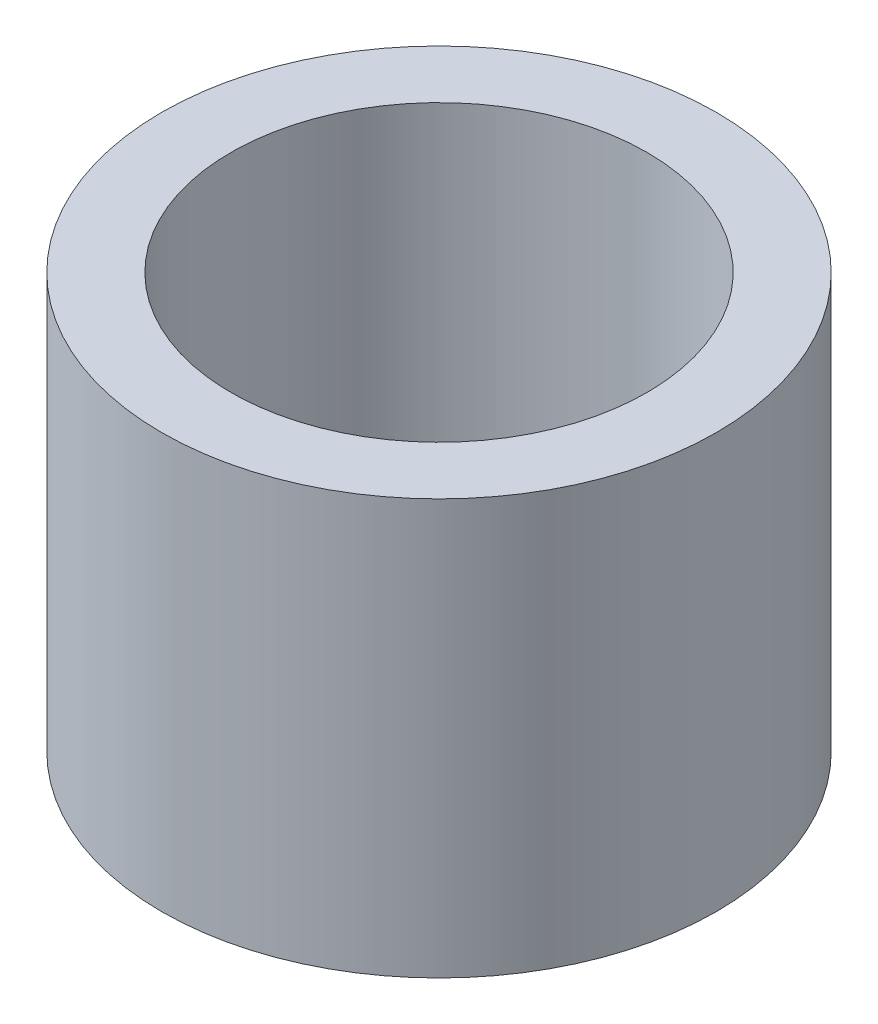
ISO-10303-21;
HEADER;
FILE_DESCRIPTION(('STEP AP214'),'2;1');
FILE_NAME('part.step','',(''),(''),'','','');
FILE_SCHEMA(('AUTOMOTIVE_DESIGN { 1 0 10303 214 1 1 1 1 }'));
ENDSEC;
DATA;
#1=APPLICATION_CONTEXT('core data for automotive mechanical design processes');
#2=APPLICATION_PROTOCOL_DEFINITION('international standard','automotive_design',2000,#1);
#3=PRODUCT_CONTEXT('',#1,'mechanical');
#4=PRODUCT('Part','Part','',(#3));
#5=PRODUCT_RELATED_PRODUCT_CATEGORY('part','',(#4));
#6=PRODUCT_DEFINITION_FORMATION('','',#4);
#7=PRODUCT_DEFINITION_CONTEXT('part definition',#1,'design');
#8=PRODUCT_DEFINITION('design','',#6,#7);
#9=PRODUCT_DEFINITION_SHAPE('','',#8);
#10=(LENGTH_UNIT() NAMED_UNIT(*) SI_UNIT(.MILLI.,.METRE.));
#11=(NAMED_UNIT(*) PLANE_ANGLE_UNIT() SI_UNIT($,.RADIAN.));
#12=(NAMED_UNIT(*) SI_UNIT($,.STERADIAN.) SOLID_ANGLE_UNIT());
#13=UNCERTAINTY_MEASURE_WITH_UNIT(LENGTH_MEASURE(1.E-05),#10,'distance_accuracy_value','');
#14=(GEOMETRIC_REPRESENTATION_CONTEXT(3) GLOBAL_UNCERTAINTY_ASSIGNED_CONTEXT((#13)) GLOBAL_UNIT_ASSIGNED_CONTEXT((#10,
#11,#12)) REPRESENTATION_CONTEXT('',''));
#15=CARTESIAN_POINT('',(0.,0.,0.));
#16=DIRECTION('',(0.,0.,1.));
#17=DIRECTION('',(1.,0.,0.));
#18=AXIS2_PLACEMENT_3D('',#15,#16,#17);
#19=CARTESIAN_POINT('',(0.,19.,0.));
#20=DIRECTION('',(0.,-1.,0.));
#21=DIRECTION('',(0.,0.,-1.));
#22=AXIS2_PLACEMENT_3D('',#19,#20,#21);
#23=CYLINDRICAL_SURFACE('',#22,12.7);
#24=CARTESIAN_POINT('',(0.,19.,0.));
#25=DIRECTION('',(0.,1.,0.));
#26=DIRECTION('',(0.,0.,1.));
#27=AXIS2_PLACEMENT_3D('',#24,#25,#26);
#28=CIRCLE('',#27,12.7);
#29=CARTESIAN_POINT('',(0.,19.,12.7));
#30=VERTEX_POINT('',#29);
#31=EDGE_CURVE('E10',#30,#30,#28,.T.);
#32=ORIENTED_EDGE('',*,*,#31,.F.);
#33=EDGE_LOOP('',(#32));
#34=FACE_BOUND('',#33,.T.);
#35=CARTESIAN_POINT('',(0.,0.,0.));
#36=DIRECTION('',(0.,1.,0.));
#37=DIRECTION('',(0.,0.,1.));
#38=AXIS2_PLACEMENT_3D('',#35,#36,#37);
#39=CIRCLE('',#38,12.7);
#40=CARTESIAN_POINT('',(0.,0.,12.7));
#41=VERTEX_POINT('',#40);
#42=EDGE_CURVE('E40',#41,#41,#39,.T.);
#43=ORIENTED_EDGE('',*,*,#42,.T.);
#44=EDGE_LOOP('',(#43));
#45=FACE_BOUND('',#44,.T.);
#46=ADVANCED_FACE('F37',(#34,#45),#23,.T.);
#47=CARTESIAN_POINT('',(0.,19.,0.));
#48=DIRECTION('',(0.,1.,0.));
#49=DIRECTION('',(0.,0.,1.));
#50=AXIS2_PLACEMENT_3D('',#47,#48,#49);
#51=PLANE('',#50);
#52=CARTESIAN_POINT('',(0.,19.,0.));
#53=DIRECTION('',(0.,-1.,0.));
#54=DIRECTION('',(0.,0.,-1.));
#55=AXIS2_PLACEMENT_3D('',#52,#53,#54);
#56=CIRCLE('',#55,9.525);
#57=CARTESIAN_POINT('',(0.,19.,-9.525));
#58=VERTEX_POINT('',#57);
#59=EDGE_CURVE('E49',#58,#58,#56,.T.);
#60=ORIENTED_EDGE('',*,*,#59,.T.);
#61=EDGE_LOOP('',(#60));
#62=FACE_BOUND('',#61,.T.);
#63=ORIENTED_EDGE('',*,*,#31,.T.);
#64=EDGE_LOOP('',(#63));
#65=FACE_BOUND('',#64,.T.);
#66=ADVANCED_FACE('F59',(#62,#65),#51,.T.);
#67=CARTESIAN_POINT('',(0.,0.,0.));
#68=DIRECTION('',(0.,1.,0.));
#69=DIRECTION('',(0.,0.,1.));
#70=AXIS2_PLACEMENT_3D('',#67,#68,#69);
#71=PLANE('',#70);
#72=CARTESIAN_POINT('',(0.,0.,0.));
#73=DIRECTION('',(0.,-1.,0.));
#74=DIRECTION('',(0.,0.,-1.));
#75=AXIS2_PLACEMENT_3D('',#72,#73,#74);
#76=CIRCLE('',#75,9.525);
#77=CARTESIAN_POINT('',(0.,0.,-9.525));
#78=VERTEX_POINT('',#77);
#79=EDGE_CURVE('E51',#78,#78,#76,.T.);
#80=ORIENTED_EDGE('',*,*,#79,.F.);
#81=EDGE_LOOP('',(#80));
#82=FACE_BOUND('',#81,.T.);
#83=ORIENTED_EDGE('',*,*,#42,.F.);
#84=EDGE_LOOP('',(#83));
#85=FACE_BOUND('',#84,.T.);
#86=ADVANCED_FACE('F64',(#82,#85),#71,.F.);
#87=CARTESIAN_POINT('',(0.,19.,0.));
#88=DIRECTION('',(0.,-1.,0.));
#89=DIRECTION('',(0.,0.,-1.));
#90=AXIS2_PLACEMENT_3D('',#87,#88,#89);
#91=CYLINDRICAL_SURFACE('',#90,9.525);
#92=ORIENTED_EDGE('',*,*,#59,.F.);
#93=EDGE_LOOP('',(#92));
#94=FACE_BOUND('',#93,.T.);
#95=ORIENTED_EDGE('',*,*,#79,.T.);
#96=EDGE_LOOP('',(#95));
#97=FACE_BOUND('',#96,.T.);
#98=ADVANCED_FACE('F61',(#94,#97),#91,.F.);
#99=CLOSED_SHELL('',(#46,#66,#86,#98));
#100=MANIFOLD_SOLID_BREP('B2',#99);
#101=ADVANCED_BREP_SHAPE_REPRESENTATION('',(#18,#100),#14);
#102=SHAPE_DEFINITION_REPRESENTATION(#9,#101);
ENDSEC;
END-ISO-10303-21;
